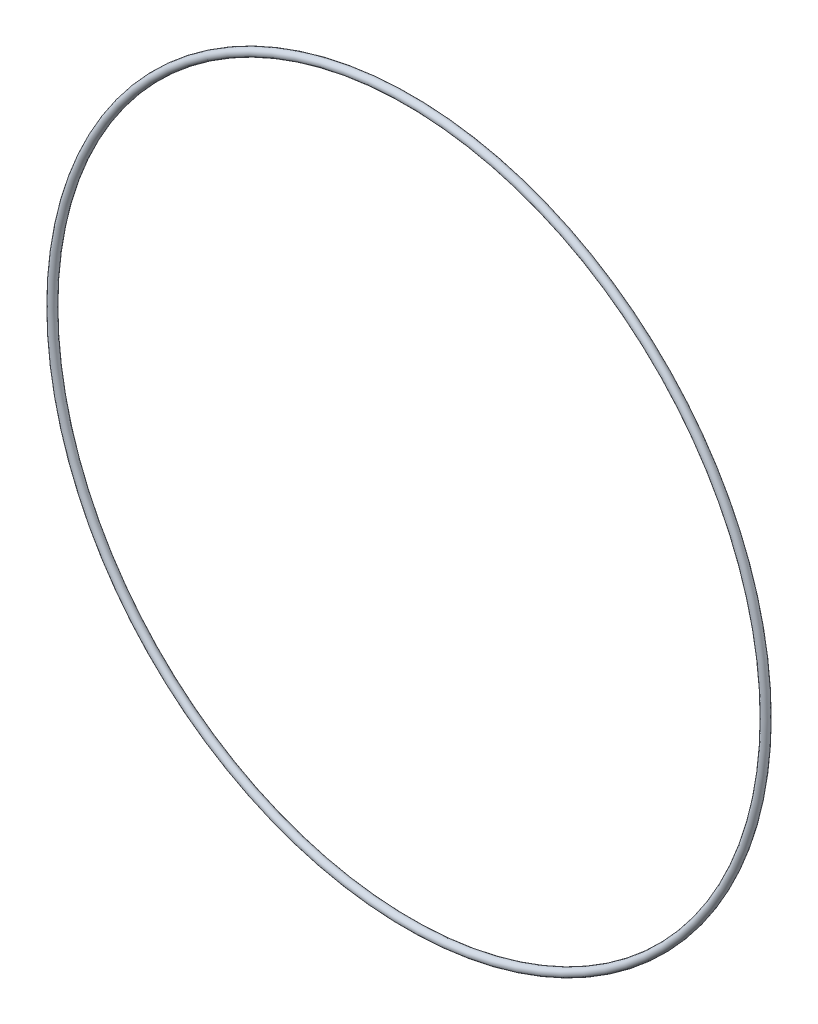
ISO-10303-21;
HEADER;
FILE_DESCRIPTION(('STEP AP214'),'2;1');
FILE_NAME('part.step','',(''),(''),'','','');
FILE_SCHEMA(('AUTOMOTIVE_DESIGN { 1 0 10303 214 1 1 1 1 }'));
ENDSEC;
DATA;
#1=APPLICATION_CONTEXT('core data for automotive mechanical design processes');
#2=APPLICATION_PROTOCOL_DEFINITION('international standard','automotive_design',2000,#1);
#3=PRODUCT_CONTEXT('',#1,'mechanical');
#4=PRODUCT('Part','Part','',(#3));
#5=PRODUCT_RELATED_PRODUCT_CATEGORY('part','',(#4));
#6=PRODUCT_DEFINITION_FORMATION('','',#4);
#7=PRODUCT_DEFINITION_CONTEXT('part definition',#1,'design');
#8=PRODUCT_DEFINITION('design','',#6,#7);
#9=PRODUCT_DEFINITION_SHAPE('','',#8);
#10=(LENGTH_UNIT() NAMED_UNIT(*) SI_UNIT(.MILLI.,.METRE.));
#11=(NAMED_UNIT(*) PLANE_ANGLE_UNIT() SI_UNIT($,.RADIAN.));
#12=(NAMED_UNIT(*) SI_UNIT($,.STERADIAN.) SOLID_ANGLE_UNIT());
#13=UNCERTAINTY_MEASURE_WITH_UNIT(LENGTH_MEASURE(1.E-05),#10,'distance_accuracy_value','');
#14=(GEOMETRIC_REPRESENTATION_CONTEXT(3) GLOBAL_UNCERTAINTY_ASSIGNED_CONTEXT((#13)) GLOBAL_UNIT_ASSIGNED_CONTEXT((#10,
#11,#12)) REPRESENTATION_CONTEXT('',''));
#15=CARTESIAN_POINT('',(0.,0.,0.));
#16=DIRECTION('',(0.,0.,1.));
#17=DIRECTION('',(1.,0.,0.));
#18=AXIS2_PLACEMENT_3D('',#15,#16,#17);
#19=CARTESIAN_POINT('',(0.,0.,0.));
#20=DIRECTION('',(0.,0.,1.));
#21=DIRECTION('',(1.,0.,0.));
#22=AXIS2_PLACEMENT_3D('',#19,#20,#21);
#23=TOROIDAL_SURFACE('',#22,118.618,1.30810000000001);
#24=CARTESIAN_POINT('',(119.9261,0.,0.));
#25=VERTEX_POINT('',#24);
#26=VERTEX_LOOP('',#25);
#27=FACE_BOUND('',#26,.T.);
#28=ADVANCED_FACE('F28',(#27),#23,.T.);
#29=CLOSED_SHELL('',(#28));
#30=MANIFOLD_SOLID_BREP('B2',#29);
#31=ADVANCED_BREP_SHAPE_REPRESENTATION('',(#18,#30),#14);
#32=SHAPE_DEFINITION_REPRESENTATION(#9,#31);
ENDSEC;
END-ISO-10303-21;
